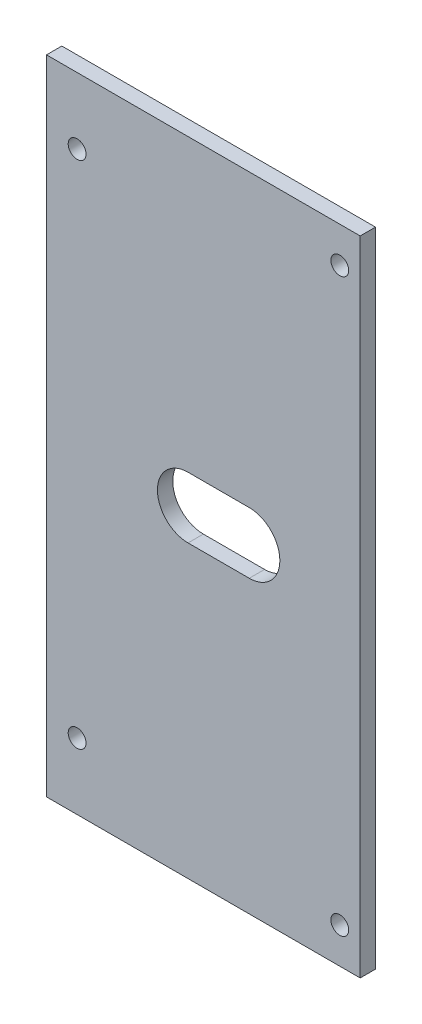
ISO-10303-21;
HEADER;
FILE_DESCRIPTION(('STEP AP214'),'2;1');
FILE_NAME('part.step','',(''),(''),'','','');
FILE_SCHEMA(('AUTOMOTIVE_DESIGN { 1 0 10303 214 1 1 1 1 }'));
ENDSEC;
DATA;
#1=APPLICATION_CONTEXT('core data for automotive mechanical design processes');
#2=APPLICATION_PROTOCOL_DEFINITION('international standard','automotive_design',2000,#1);
#3=PRODUCT_CONTEXT('',#1,'mechanical');
#4=PRODUCT('Part','Part','',(#3));
#5=PRODUCT_RELATED_PRODUCT_CATEGORY('part','',(#4));
#6=PRODUCT_DEFINITION_FORMATION('','',#4);
#7=PRODUCT_DEFINITION_CONTEXT('part definition',#1,'design');
#8=PRODUCT_DEFINITION('design','',#6,#7);
#9=PRODUCT_DEFINITION_SHAPE('','',#8);
#10=(LENGTH_UNIT() NAMED_UNIT(*) SI_UNIT(.MILLI.,.METRE.));
#11=(NAMED_UNIT(*) PLANE_ANGLE_UNIT() SI_UNIT($,.RADIAN.));
#12=(NAMED_UNIT(*) SI_UNIT($,.STERADIAN.) SOLID_ANGLE_UNIT());
#13=UNCERTAINTY_MEASURE_WITH_UNIT(LENGTH_MEASURE(1.E-05),#10,'distance_accuracy_value','');
#14=(GEOMETRIC_REPRESENTATION_CONTEXT(3) GLOBAL_UNCERTAINTY_ASSIGNED_CONTEXT((#13)) GLOBAL_UNIT_ASSIGNED_CONTEXT((#10,
#11,#12)) REPRESENTATION_CONTEXT('',''));
#15=CARTESIAN_POINT('',(0.,0.,0.));
#16=DIRECTION('',(0.,0.,1.));
#17=DIRECTION('',(1.,0.,0.));
#18=AXIS2_PLACEMENT_3D('',#15,#16,#17);
#19=CARTESIAN_POINT('',(0.,0.,3.));
#20=DIRECTION('',(0.,0.,-1.));
#21=DIRECTION('',(-1.,0.,0.));
#22=AXIS2_PLACEMENT_3D('',#19,#20,#21);
#23=PLANE('',#22);
#24=DIRECTION('',(1.,0.,0.));
#25=VECTOR('',#24,1.);
#26=CARTESIAN_POINT('',(-33.75,-6.00000000000001,3.));
#27=LINE('',#26,#25);
#28=CARTESIAN_POINT('',(-33.75,-6.00000000000001,3.));
#29=VERTEX_POINT('',#28);
#30=CARTESIAN_POINT('',(-21.75,-6.00000000000001,3.));
#31=VERTEX_POINT('',#30);
#32=EDGE_CURVE('E121',#29,#31,#27,.T.);
#33=ORIENTED_EDGE('',*,*,#32,.F.);
#34=CARTESIAN_POINT('',(-33.75,0.,3.));
#35=DIRECTION('',(0.,0.,1.));
#36=DIRECTION('',(1.,0.,0.));
#37=AXIS2_PLACEMENT_3D('',#34,#35,#36);
#38=CIRCLE('',#37,6.);
#39=CARTESIAN_POINT('',(-33.75,6.,3.));
#40=VERTEX_POINT('',#39);
#41=EDGE_CURVE('E53',#40,#29,#38,.T.);
#42=ORIENTED_EDGE('',*,*,#41,.F.);
#43=DIRECTION('',(-1.,0.,0.));
#44=VECTOR('',#43,1.);
#45=CARTESIAN_POINT('',(-33.75,6.,3.));
#46=LINE('',#45,#44);
#47=CARTESIAN_POINT('',(-21.75,6.,3.));
#48=VERTEX_POINT('',#47);
#49=EDGE_CURVE('E118',#48,#40,#46,.T.);
#50=ORIENTED_EDGE('',*,*,#49,.F.);
#51=CARTESIAN_POINT('',(-21.75,0.,3.));
#52=DIRECTION('',(0.,0.,1.));
#53=DIRECTION('',(1.,0.,0.));
#54=AXIS2_PLACEMENT_3D('',#51,#52,#53);
#55=CIRCLE('',#54,6.);
#56=EDGE_CURVE('E127',#31,#48,#55,.T.);
#57=ORIENTED_EDGE('',*,*,#56,.F.);
#58=EDGE_LOOP('',(#33,#42,#50,#57));
#59=FACE_BOUND('',#58,.T.);
#60=DIRECTION('',(0.,1.,0.));
#61=VECTOR('',#60,1.);
#62=CARTESIAN_POINT('',(0.,-63.,3.));
#63=LINE('',#62,#61);
#64=CARTESIAN_POINT('',(0.,-63.,3.));
#65=VERTEX_POINT('',#64);
#66=CARTESIAN_POINT('',(0.,63.,3.));
#67=VERTEX_POINT('',#66);
#68=EDGE_CURVE('E161',#65,#67,#63,.T.);
#69=ORIENTED_EDGE('',*,*,#68,.T.);
#70=DIRECTION('',(-1.,0.,0.));
#71=VECTOR('',#70,1.);
#72=CARTESIAN_POINT('',(-61.5,63.,3.));
#73=LINE('',#72,#71);
#74=CARTESIAN_POINT('',(-61.5,63.,3.));
#75=VERTEX_POINT('',#74);
#76=EDGE_CURVE('E168',#67,#75,#73,.T.);
#77=ORIENTED_EDGE('',*,*,#76,.T.);
#78=DIRECTION('',(0.,-1.,0.));
#79=VECTOR('',#78,1.);
#80=CARTESIAN_POINT('',(-61.5,-63.,3.));
#81=LINE('',#80,#79);
#82=CARTESIAN_POINT('',(-61.5,-63.,3.));
#83=VERTEX_POINT('',#82);
#84=EDGE_CURVE('E170',#75,#83,#81,.T.);
#85=ORIENTED_EDGE('',*,*,#84,.T.);
#86=DIRECTION('',(1.,0.,0.));
#87=VECTOR('',#86,1.);
#88=CARTESIAN_POINT('',(-61.5,-63.,3.));
#89=LINE('',#88,#87);
#90=EDGE_CURVE('E173',#83,#65,#89,.T.);
#91=ORIENTED_EDGE('',*,*,#90,.T.);
#92=EDGE_LOOP('',(#69,#77,#85,#91));
#93=FACE_BOUND('',#92,.T.);
#94=CARTESIAN_POINT('',(-4.,56.,3.));
#95=DIRECTION('',(0.,0.,1.));
#96=DIRECTION('',(1.,0.,0.));
#97=AXIS2_PLACEMENT_3D('',#94,#95,#96);
#98=CIRCLE('',#97,1.75);
#99=CARTESIAN_POINT('',(-2.25,56.,3.));
#100=VERTEX_POINT('',#99);
#101=EDGE_CURVE('E160',#100,#100,#98,.T.);
#102=ORIENTED_EDGE('',*,*,#101,.F.);
#103=EDGE_LOOP('',(#102));
#104=FACE_BOUND('',#103,.T.);
#105=CARTESIAN_POINT('',(-55.5,50.,3.));
#106=DIRECTION('',(0.,0.,1.));
#107=DIRECTION('',(1.,0.,0.));
#108=AXIS2_PLACEMENT_3D('',#105,#106,#107);
#109=CIRCLE('',#108,1.75);
#110=CARTESIAN_POINT('',(-53.75,50.,3.));
#111=VERTEX_POINT('',#110);
#112=EDGE_CURVE('E153',#111,#111,#109,.T.);
#113=ORIENTED_EDGE('',*,*,#112,.F.);
#114=EDGE_LOOP('',(#113));
#115=FACE_BOUND('',#114,.T.);
#116=CARTESIAN_POINT('',(-4.,-56.,3.));
#117=DIRECTION('',(0.,0.,1.));
#118=DIRECTION('',(-1.,0.,0.));
#119=AXIS2_PLACEMENT_3D('',#116,#117,#118);
#120=CIRCLE('',#119,1.75);
#121=CARTESIAN_POINT('',(-5.75,-56.,3.));
#122=VERTEX_POINT('',#121);
#123=EDGE_CURVE('E144',#122,#122,#120,.T.);
#124=ORIENTED_EDGE('',*,*,#123,.F.);
#125=EDGE_LOOP('',(#124));
#126=FACE_BOUND('',#125,.T.);
#127=CARTESIAN_POINT('',(-55.5,-50.,3.));
#128=DIRECTION('',(0.,0.,1.));
#129=DIRECTION('',(-1.,0.,0.));
#130=AXIS2_PLACEMENT_3D('',#127,#128,#129);
#131=CIRCLE('',#130,1.75);
#132=CARTESIAN_POINT('',(-57.25,-50.,3.));
#133=VERTEX_POINT('',#132);
#134=EDGE_CURVE('E137',#133,#133,#131,.T.);
#135=ORIENTED_EDGE('',*,*,#134,.F.);
#136=EDGE_LOOP('',(#135));
#137=FACE_BOUND('',#136,.T.);
#138=ADVANCED_FACE('F39',(#59,#93,#104,#115,#126,#137),#23,.F.);
#139=CARTESIAN_POINT('',(0.,0.,0.));
#140=DIRECTION('',(0.,0.,-1.));
#141=DIRECTION('',(-1.,0.,0.));
#142=AXIS2_PLACEMENT_3D('',#139,#140,#141);
#143=PLANE('',#142);
#144=CARTESIAN_POINT('',(-33.75,0.,0.));
#145=DIRECTION('',(0.,0.,-1.));
#146=DIRECTION('',(-1.,0.,0.));
#147=AXIS2_PLACEMENT_3D('',#144,#145,#146);
#148=CIRCLE('',#147,6.);
#149=CARTESIAN_POINT('',(-33.75,6.,0.));
#150=VERTEX_POINT('',#149);
#151=CARTESIAN_POINT('',(-33.75,-6.00000000000001,0.));
#152=VERTEX_POINT('',#151);
#153=EDGE_CURVE('E114',#150,#152,#148,.F.);
#154=ORIENTED_EDGE('',*,*,#153,.T.);
#155=DIRECTION('',(1.,0.,0.));
#156=VECTOR('',#155,1.);
#157=CARTESIAN_POINT('',(-33.75,-6.00000000000001,0.));
#158=LINE('',#157,#156);
#159=CARTESIAN_POINT('',(-21.75,-6.00000000000001,0.));
#160=VERTEX_POINT('',#159);
#161=EDGE_CURVE('E104',#152,#160,#158,.T.);
#162=ORIENTED_EDGE('',*,*,#161,.T.);
#163=CARTESIAN_POINT('',(-21.75,0.,0.));
#164=DIRECTION('',(0.,0.,-1.));
#165=DIRECTION('',(-1.,0.,0.));
#166=AXIS2_PLACEMENT_3D('',#163,#164,#165);
#167=CIRCLE('',#166,6.);
#168=CARTESIAN_POINT('',(-21.75,6.,0.));
#169=VERTEX_POINT('',#168);
#170=EDGE_CURVE('E124',#160,#169,#167,.F.);
#171=ORIENTED_EDGE('',*,*,#170,.T.);
#172=DIRECTION('',(-1.,0.,0.));
#173=VECTOR('',#172,1.);
#174=CARTESIAN_POINT('',(-33.75,6.,0.));
#175=LINE('',#174,#173);
#176=EDGE_CURVE('E123',#169,#150,#175,.T.);
#177=ORIENTED_EDGE('',*,*,#176,.T.);
#178=EDGE_LOOP('',(#154,#162,#171,#177));
#179=FACE_BOUND('',#178,.T.);
#180=CARTESIAN_POINT('',(-4.,-56.,0.));
#181=DIRECTION('',(0.,0.,1.));
#182=DIRECTION('',(-1.,0.,0.));
#183=AXIS2_PLACEMENT_3D('',#180,#181,#182);
#184=CIRCLE('',#183,1.75);
#185=CARTESIAN_POINT('',(-5.75,-56.,0.));
#186=VERTEX_POINT('',#185);
#187=EDGE_CURVE('E145',#186,#186,#184,.T.);
#188=ORIENTED_EDGE('',*,*,#187,.T.);
#189=EDGE_LOOP('',(#188));
#190=FACE_BOUND('',#189,.T.);
#191=CARTESIAN_POINT('',(-4.,56.,0.));
#192=DIRECTION('',(0.,0.,1.));
#193=DIRECTION('',(1.,0.,0.));
#194=AXIS2_PLACEMENT_3D('',#191,#192,#193);
#195=CIRCLE('',#194,1.75);
#196=CARTESIAN_POINT('',(-2.25,56.,0.));
#197=VERTEX_POINT('',#196);
#198=EDGE_CURVE('E152',#197,#197,#195,.T.);
#199=ORIENTED_EDGE('',*,*,#198,.T.);
#200=EDGE_LOOP('',(#199));
#201=FACE_BOUND('',#200,.T.);
#202=DIRECTION('',(0.,1.,0.));
#203=VECTOR('',#202,1.);
#204=CARTESIAN_POINT('',(0.,-63.,0.));
#205=LINE('',#204,#203);
#206=CARTESIAN_POINT('',(0.,-63.,0.));
#207=VERTEX_POINT('',#206);
#208=CARTESIAN_POINT('',(0.,63.,0.));
#209=VERTEX_POINT('',#208);
#210=EDGE_CURVE('E158',#207,#209,#205,.T.);
#211=ORIENTED_EDGE('',*,*,#210,.F.);
#212=DIRECTION('',(1.,0.,0.));
#213=VECTOR('',#212,1.);
#214=CARTESIAN_POINT('',(-61.5,-63.,0.));
#215=LINE('',#214,#213);
#216=CARTESIAN_POINT('',(-61.5,-63.,0.));
#217=VERTEX_POINT('',#216);
#218=EDGE_CURVE('E167',#217,#207,#215,.T.);
#219=ORIENTED_EDGE('',*,*,#218,.F.);
#220=DIRECTION('',(0.,-1.,0.));
#221=VECTOR('',#220,1.);
#222=CARTESIAN_POINT('',(-61.5,-63.,0.));
#223=LINE('',#222,#221);
#224=CARTESIAN_POINT('',(-61.5,63.,0.));
#225=VERTEX_POINT('',#224);
#226=EDGE_CURVE('E178',#225,#217,#223,.T.);
#227=ORIENTED_EDGE('',*,*,#226,.F.);
#228=DIRECTION('',(-1.,0.,0.));
#229=VECTOR('',#228,1.);
#230=CARTESIAN_POINT('',(-61.5,63.,0.));
#231=LINE('',#230,#229);
#232=EDGE_CURVE('E176',#209,#225,#231,.T.);
#233=ORIENTED_EDGE('',*,*,#232,.F.);
#234=EDGE_LOOP('',(#211,#219,#227,#233));
#235=FACE_BOUND('',#234,.T.);
#236=CARTESIAN_POINT('',(-55.5,50.,0.));
#237=DIRECTION('',(0.,0.,1.));
#238=DIRECTION('',(1.,0.,0.));
#239=AXIS2_PLACEMENT_3D('',#236,#237,#238);
#240=CIRCLE('',#239,1.75);
#241=CARTESIAN_POINT('',(-53.75,50.,0.));
#242=VERTEX_POINT('',#241);
#243=EDGE_CURVE('E149',#242,#242,#240,.T.);
#244=ORIENTED_EDGE('',*,*,#243,.T.);
#245=EDGE_LOOP('',(#244));
#246=FACE_BOUND('',#245,.T.);
#247=CARTESIAN_POINT('',(-55.5,-50.,0.));
#248=DIRECTION('',(0.,0.,1.));
#249=DIRECTION('',(-1.,0.,0.));
#250=AXIS2_PLACEMENT_3D('',#247,#248,#249);
#251=CIRCLE('',#250,1.75);
#252=CARTESIAN_POINT('',(-57.25,-50.,0.));
#253=VERTEX_POINT('',#252);
#254=EDGE_CURVE('E109',#253,#253,#251,.T.);
#255=ORIENTED_EDGE('',*,*,#254,.T.);
#256=EDGE_LOOP('',(#255));
#257=FACE_BOUND('',#256,.T.);
#258=ADVANCED_FACE('F117',(#179,#190,#201,#235,#246,#257),#143,.T.);
#259=CARTESIAN_POINT('',(0.,-63.,3.));
#260=DIRECTION('',(-1.,0.,0.));
#261=DIRECTION('',(0.,0.,1.));
#262=AXIS2_PLACEMENT_3D('',#259,#260,#261);
#263=PLANE('',#262);
#264=ORIENTED_EDGE('',*,*,#210,.T.);
#265=DIRECTION('',(0.,0.,-1.));
#266=VECTOR('',#265,1.);
#267=CARTESIAN_POINT('',(0.,63.,3.));
#268=LINE('',#267,#266);
#269=EDGE_CURVE('E11',#67,#209,#268,.T.);
#270=ORIENTED_EDGE('',*,*,#269,.F.);
#271=ORIENTED_EDGE('',*,*,#68,.F.);
#272=DIRECTION('',(0.,0.,-1.));
#273=VECTOR('',#272,1.);
#274=CARTESIAN_POINT('',(0.,-63.,3.));
#275=LINE('',#274,#273);
#276=EDGE_CURVE('E171',#65,#207,#275,.T.);
#277=ORIENTED_EDGE('',*,*,#276,.T.);
#278=EDGE_LOOP('',(#264,#270,#271,#277));
#279=FACE_BOUND('',#278,.T.);
#280=ADVANCED_FACE('F41',(#279),#263,.F.);
#281=CARTESIAN_POINT('',(-61.5,63.,3.));
#282=DIRECTION('',(0.,-1.,0.));
#283=DIRECTION('',(0.,0.,-1.));
#284=AXIS2_PLACEMENT_3D('',#281,#282,#283);
#285=PLANE('',#284);
#286=ORIENTED_EDGE('',*,*,#232,.T.);
#287=DIRECTION('',(0.,0.,-1.));
#288=VECTOR('',#287,1.);
#289=CARTESIAN_POINT('',(-61.5,63.,3.));
#290=LINE('',#289,#288);
#291=EDGE_CURVE('E50',#75,#225,#290,.T.);
#292=ORIENTED_EDGE('',*,*,#291,.F.);
#293=ORIENTED_EDGE('',*,*,#76,.F.);
#294=ORIENTED_EDGE('',*,*,#269,.T.);
#295=EDGE_LOOP('',(#286,#292,#293,#294));
#296=FACE_BOUND('',#295,.T.);
#297=ADVANCED_FACE('F208',(#296),#285,.F.);
#298=CARTESIAN_POINT('',(-61.5,-63.,3.));
#299=DIRECTION('',(1.,0.,0.));
#300=DIRECTION('',(0.,0.,-1.));
#301=AXIS2_PLACEMENT_3D('',#298,#299,#300);
#302=PLANE('',#301);
#303=ORIENTED_EDGE('',*,*,#226,.T.);
#304=DIRECTION('',(0.,0.,-1.));
#305=VECTOR('',#304,1.);
#306=CARTESIAN_POINT('',(-61.5,-63.,3.));
#307=LINE('',#306,#305);
#308=EDGE_CURVE('E183',#83,#217,#307,.T.);
#309=ORIENTED_EDGE('',*,*,#308,.F.);
#310=ORIENTED_EDGE('',*,*,#84,.F.);
#311=ORIENTED_EDGE('',*,*,#291,.T.);
#312=EDGE_LOOP('',(#303,#309,#310,#311));
#313=FACE_BOUND('',#312,.T.);
#314=ADVANCED_FACE('F189',(#313),#302,.F.);
#315=CARTESIAN_POINT('',(-61.5,-63.,3.));
#316=DIRECTION('',(0.,1.,0.));
#317=DIRECTION('',(0.,0.,1.));
#318=AXIS2_PLACEMENT_3D('',#315,#316,#317);
#319=PLANE('',#318);
#320=ORIENTED_EDGE('',*,*,#218,.T.);
#321=ORIENTED_EDGE('',*,*,#276,.F.);
#322=ORIENTED_EDGE('',*,*,#90,.F.);
#323=ORIENTED_EDGE('',*,*,#308,.T.);
#324=EDGE_LOOP('',(#320,#321,#322,#323));
#325=FACE_BOUND('',#324,.T.);
#326=ADVANCED_FACE('F197',(#325),#319,.F.);
#327=CARTESIAN_POINT('',(-4.,56.,3.));
#328=DIRECTION('',(0.,0.,-1.));
#329=DIRECTION('',(-1.,0.,0.));
#330=AXIS2_PLACEMENT_3D('',#327,#328,#329);
#331=CYLINDRICAL_SURFACE('',#330,1.75);
#332=ORIENTED_EDGE('',*,*,#101,.T.);
#333=EDGE_LOOP('',(#332));
#334=FACE_BOUND('',#333,.T.);
#335=ORIENTED_EDGE('',*,*,#198,.F.);
#336=EDGE_LOOP('',(#335));
#337=FACE_BOUND('',#336,.T.);
#338=ADVANCED_FACE('F225',(#334,#337),#331,.F.);
#339=CARTESIAN_POINT('',(-55.5,50.,3.));
#340=DIRECTION('',(0.,0.,-1.));
#341=DIRECTION('',(-1.,0.,0.));
#342=AXIS2_PLACEMENT_3D('',#339,#340,#341);
#343=CYLINDRICAL_SURFACE('',#342,1.75);
#344=ORIENTED_EDGE('',*,*,#112,.T.);
#345=EDGE_LOOP('',(#344));
#346=FACE_BOUND('',#345,.T.);
#347=ORIENTED_EDGE('',*,*,#243,.F.);
#348=EDGE_LOOP('',(#347));
#349=FACE_BOUND('',#348,.T.);
#350=ADVANCED_FACE('F227',(#346,#349),#343,.F.);
#351=CARTESIAN_POINT('',(-4.,-56.,3.));
#352=DIRECTION('',(0.,0.,-1.));
#353=DIRECTION('',(-1.,0.,0.));
#354=AXIS2_PLACEMENT_3D('',#351,#352,#353);
#355=CYLINDRICAL_SURFACE('',#354,1.75);
#356=ORIENTED_EDGE('',*,*,#123,.T.);
#357=EDGE_LOOP('',(#356));
#358=FACE_BOUND('',#357,.T.);
#359=ORIENTED_EDGE('',*,*,#187,.F.);
#360=EDGE_LOOP('',(#359));
#361=FACE_BOUND('',#360,.T.);
#362=ADVANCED_FACE('F233',(#358,#361),#355,.F.);
#363=CARTESIAN_POINT('',(-55.5,-50.,3.));
#364=DIRECTION('',(0.,0.,-1.));
#365=DIRECTION('',(-1.,0.,0.));
#366=AXIS2_PLACEMENT_3D('',#363,#364,#365);
#367=CYLINDRICAL_SURFACE('',#366,1.75);
#368=ORIENTED_EDGE('',*,*,#134,.T.);
#369=EDGE_LOOP('',(#368));
#370=FACE_BOUND('',#369,.T.);
#371=ORIENTED_EDGE('',*,*,#254,.F.);
#372=EDGE_LOOP('',(#371));
#373=FACE_BOUND('',#372,.T.);
#374=ADVANCED_FACE('F250',(#370,#373),#367,.F.);
#375=CARTESIAN_POINT('',(-33.75,0.,-0.00100000000000013));
#376=DIRECTION('',(0.,0.,1.));
#377=DIRECTION('',(1.,0.,0.));
#378=AXIS2_PLACEMENT_3D('',#375,#376,#377);
#379=CYLINDRICAL_SURFACE('',#378,6.);
#380=DIRECTION('',(0.,0.,1.));
#381=VECTOR('',#380,1.);
#382=CARTESIAN_POINT('',(-33.75,6.,-0.00100000000000013));
#383=LINE('',#382,#381);
#384=EDGE_CURVE('E112',#150,#40,#383,.T.);
#385=ORIENTED_EDGE('',*,*,#384,.T.);
#386=ORIENTED_EDGE('',*,*,#41,.T.);
#387=DIRECTION('',(0.,0.,1.));
#388=VECTOR('',#387,1.);
#389=CARTESIAN_POINT('',(-33.75,-6.00000000000001,-0.00100000000000013));
#390=LINE('',#389,#388);
#391=EDGE_CURVE('E103',#152,#29,#390,.T.);
#392=ORIENTED_EDGE('',*,*,#391,.F.);
#393=ORIENTED_EDGE('',*,*,#153,.F.);
#394=EDGE_LOOP('',(#385,#386,#392,#393));
#395=FACE_BOUND('',#394,.T.);
#396=ADVANCED_FACE('F111',(#395),#379,.F.);
#397=CARTESIAN_POINT('',(-33.75,6.,-0.00100000000000013));
#398=DIRECTION('',(0.,1.,0.));
#399=DIRECTION('',(0.,0.,1.));
#400=AXIS2_PLACEMENT_3D('',#397,#398,#399);
#401=PLANE('',#400);
#402=DIRECTION('',(0.,0.,1.));
#403=VECTOR('',#402,1.);
#404=CARTESIAN_POINT('',(-21.75,6.,-0.00100000000000013));
#405=LINE('',#404,#403);
#406=EDGE_CURVE('E136',#169,#48,#405,.T.);
#407=ORIENTED_EDGE('',*,*,#406,.T.);
#408=ORIENTED_EDGE('',*,*,#49,.T.);
#409=ORIENTED_EDGE('',*,*,#384,.F.);
#410=ORIENTED_EDGE('',*,*,#176,.F.);
#411=EDGE_LOOP('',(#407,#408,#409,#410));
#412=FACE_BOUND('',#411,.T.);
#413=ADVANCED_FACE('F258',(#412),#401,.F.);
#414=CARTESIAN_POINT('',(-21.75,0.,-0.00100000000000013));
#415=DIRECTION('',(0.,0.,1.));
#416=DIRECTION('',(1.,0.,0.));
#417=AXIS2_PLACEMENT_3D('',#414,#415,#416);
#418=CYLINDRICAL_SURFACE('',#417,6.);
#419=DIRECTION('',(0.,0.,1.));
#420=VECTOR('',#419,1.);
#421=CARTESIAN_POINT('',(-21.75,-6.00000000000001,-0.00100000000000013));
#422=LINE('',#421,#420);
#423=EDGE_CURVE('E65',#160,#31,#422,.T.);
#424=ORIENTED_EDGE('',*,*,#423,.T.);
#425=ORIENTED_EDGE('',*,*,#56,.T.);
#426=ORIENTED_EDGE('',*,*,#406,.F.);
#427=ORIENTED_EDGE('',*,*,#170,.F.);
#428=EDGE_LOOP('',(#424,#425,#426,#427));
#429=FACE_BOUND('',#428,.T.);
#430=ADVANCED_FACE('F261',(#429),#418,.F.);
#431=CARTESIAN_POINT('',(-33.75,-6.00000000000001,-0.00100000000000013));
#432=DIRECTION('',(0.,-1.,0.));
#433=DIRECTION('',(0.,0.,-1.));
#434=AXIS2_PLACEMENT_3D('',#431,#432,#433);
#435=PLANE('',#434);
#436=ORIENTED_EDGE('',*,*,#391,.T.);
#437=ORIENTED_EDGE('',*,*,#32,.T.);
#438=ORIENTED_EDGE('',*,*,#423,.F.);
#439=ORIENTED_EDGE('',*,*,#161,.F.);
#440=EDGE_LOOP('',(#436,#437,#438,#439));
#441=FACE_BOUND('',#440,.T.);
#442=ADVANCED_FACE('F101',(#441),#435,.F.);
#443=CLOSED_SHELL('',(#138,#258,#280,#297,#314,#326,#338,#350,#362,#374,#396,#413,#430,#442));
#444=MANIFOLD_SOLID_BREP('B2',#443);
#445=ADVANCED_BREP_SHAPE_REPRESENTATION('',(#18,#444),#14);
#446=SHAPE_DEFINITION_REPRESENTATION(#9,#445);
ENDSEC;
END-ISO-10303-21;
